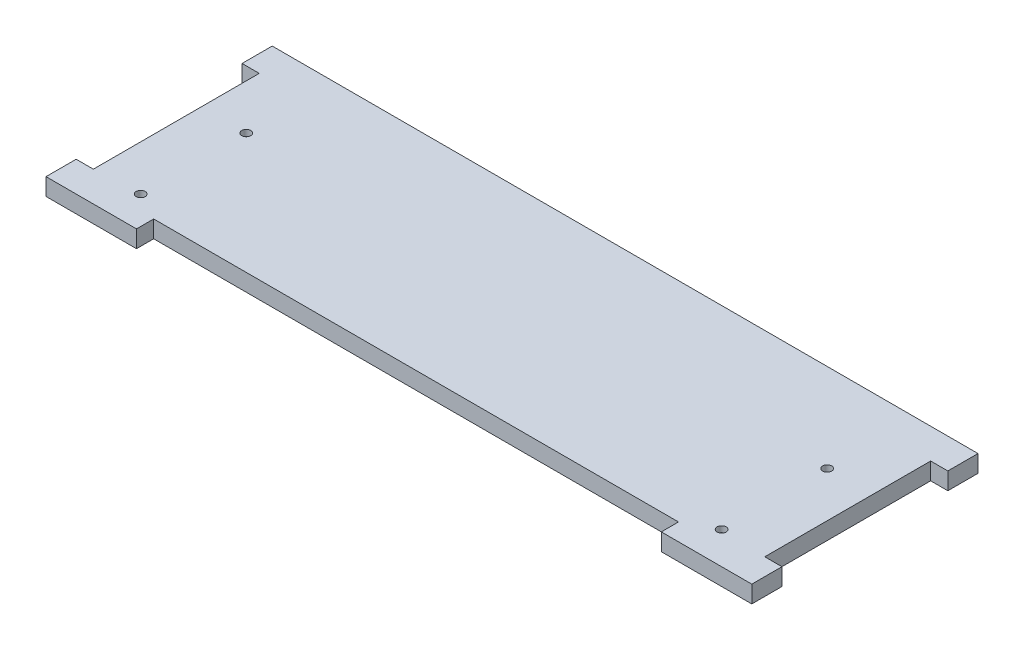
ISO-10303-21;
HEADER;
FILE_DESCRIPTION(('STEP AP214'),'2;1');
FILE_NAME('part.step','',(''),(''),'','','');
FILE_SCHEMA(('AUTOMOTIVE_DESIGN { 1 0 10303 214 1 1 1 1 }'));
ENDSEC;
DATA;
#1=APPLICATION_CONTEXT('core data for automotive mechanical design processes');
#2=APPLICATION_PROTOCOL_DEFINITION('international standard','automotive_design',2000,#1);
#3=PRODUCT_CONTEXT('',#1,'mechanical');
#4=PRODUCT('Part','Part','',(#3));
#5=PRODUCT_RELATED_PRODUCT_CATEGORY('part','',(#4));
#6=PRODUCT_DEFINITION_FORMATION('','',#4);
#7=PRODUCT_DEFINITION_CONTEXT('part definition',#1,'design');
#8=PRODUCT_DEFINITION('design','',#6,#7);
#9=PRODUCT_DEFINITION_SHAPE('','',#8);
#10=(LENGTH_UNIT() NAMED_UNIT(*) SI_UNIT(.MILLI.,.METRE.));
#11=(NAMED_UNIT(*) PLANE_ANGLE_UNIT() SI_UNIT($,.RADIAN.));
#12=(NAMED_UNIT(*) SI_UNIT($,.STERADIAN.) SOLID_ANGLE_UNIT());
#13=UNCERTAINTY_MEASURE_WITH_UNIT(LENGTH_MEASURE(1.E-05),#10,'distance_accuracy_value','');
#14=(GEOMETRIC_REPRESENTATION_CONTEXT(3) GLOBAL_UNCERTAINTY_ASSIGNED_CONTEXT((#13)) GLOBAL_UNIT_ASSIGNED_CONTEXT((#10,
#11,#12)) REPRESENTATION_CONTEXT('',''));
#15=CARTESIAN_POINT('',(0.,0.,0.));
#16=DIRECTION('',(0.,0.,1.));
#17=DIRECTION('',(1.,0.,0.));
#18=AXIS2_PLACEMENT_3D('',#15,#16,#17);
#19=CARTESIAN_POINT('',(0.,5.7,0.));
#20=DIRECTION('',(0.,0.,-1.));
#21=DIRECTION('',(-1.,0.,0.));
#22=AXIS2_PLACEMENT_3D('',#19,#20,#21);
#23=PLANE('',#22);
#24=DIRECTION('',(1.,0.,0.));
#25=VECTOR('',#24,1.);
#26=CARTESIAN_POINT('',(0.,0.,0.));
#27=LINE('',#26,#25);
#28=CARTESIAN_POINT('',(0.,0.,0.));
#29=VERTEX_POINT('',#28);
#30=CARTESIAN_POINT('',(30.,0.,0.));
#31=VERTEX_POINT('',#30);
#32=EDGE_CURVE('E162',#29,#31,#27,.T.);
#33=ORIENTED_EDGE('',*,*,#32,.T.);
#34=DIRECTION('',(0.,1.,0.));
#35=VECTOR('',#34,1.);
#36=CARTESIAN_POINT('',(30.,0.,0.));
#37=LINE('',#36,#35);
#38=CARTESIAN_POINT('',(30.,5.7,0.));
#39=VERTEX_POINT('',#38);
#40=EDGE_CURVE('E146',#31,#39,#37,.T.);
#41=ORIENTED_EDGE('',*,*,#40,.T.);
#42=DIRECTION('',(1.,0.,0.));
#43=VECTOR('',#42,1.);
#44=CARTESIAN_POINT('',(0.,5.7,0.));
#45=LINE('',#44,#43);
#46=CARTESIAN_POINT('',(0.,5.7,0.));
#47=VERTEX_POINT('',#46);
#48=EDGE_CURVE('E257',#47,#39,#45,.T.);
#49=ORIENTED_EDGE('',*,*,#48,.F.);
#50=DIRECTION('',(0.,-1.,0.));
#51=VECTOR('',#50,1.);
#52=CARTESIAN_POINT('',(0.,5.7,0.));
#53=LINE('',#52,#51);
#54=EDGE_CURVE('E11',#47,#29,#53,.T.);
#55=ORIENTED_EDGE('',*,*,#54,.T.);
#56=EDGE_LOOP('',(#33,#41,#49,#55));
#57=FACE_BOUND('',#56,.T.);
#58=ADVANCED_FACE('F33',(#57),#23,.F.);
#59=CARTESIAN_POINT('',(234.,5.7,0.));
#60=DIRECTION('',(-1.,0.,0.));
#61=DIRECTION('',(0.,0.,1.));
#62=AXIS2_PLACEMENT_3D('',#59,#60,#61);
#63=PLANE('',#62);
#64=DIRECTION('',(0.,0.,-1.));
#65=VECTOR('',#64,1.);
#66=CARTESIAN_POINT('',(234.,0.,0.));
#67=LINE('',#66,#65);
#68=CARTESIAN_POINT('',(234.,0.,0.));
#69=VERTEX_POINT('',#68);
#70=CARTESIAN_POINT('',(234.,0.,-10.));
#71=VERTEX_POINT('',#70);
#72=EDGE_CURVE('E171',#69,#71,#67,.T.);
#73=ORIENTED_EDGE('',*,*,#72,.T.);
#74=DIRECTION('',(0.,1.,0.));
#75=VECTOR('',#74,1.);
#76=CARTESIAN_POINT('',(234.,0.,-10.));
#77=LINE('',#76,#75);
#78=CARTESIAN_POINT('',(234.,5.7,-10.));
#79=VERTEX_POINT('',#78);
#80=EDGE_CURVE('E221',#71,#79,#77,.T.);
#81=ORIENTED_EDGE('',*,*,#80,.T.);
#82=DIRECTION('',(0.,0.,-1.));
#83=VECTOR('',#82,1.);
#84=CARTESIAN_POINT('',(234.,5.7,0.));
#85=LINE('',#84,#83);
#86=CARTESIAN_POINT('',(234.,5.7,0.));
#87=VERTEX_POINT('',#86);
#88=EDGE_CURVE('E195',#87,#79,#85,.T.);
#89=ORIENTED_EDGE('',*,*,#88,.F.);
#90=DIRECTION('',(0.,-1.,0.));
#91=VECTOR('',#90,1.);
#92=CARTESIAN_POINT('',(234.,5.7,0.));
#93=LINE('',#92,#91);
#94=EDGE_CURVE('E41',#87,#69,#93,.T.);
#95=ORIENTED_EDGE('',*,*,#94,.T.);
#96=EDGE_LOOP('',(#73,#81,#89,#95));
#97=FACE_BOUND('',#96,.T.);
#98=ADVANCED_FACE('F192',(#97),#63,.F.);
#99=CARTESIAN_POINT('',(0.,5.7,0.));
#100=DIRECTION('',(1.,0.,0.));
#101=DIRECTION('',(0.,0.,-1.));
#102=AXIS2_PLACEMENT_3D('',#99,#100,#101);
#103=PLANE('',#102);
#104=DIRECTION('',(0.,0.,1.));
#105=VECTOR('',#104,1.);
#106=CARTESIAN_POINT('',(0.,0.,0.));
#107=LINE('',#106,#105);
#108=CARTESIAN_POINT('',(0.,0.,-75.));
#109=VERTEX_POINT('',#108);
#110=CARTESIAN_POINT('',(0.,0.,-65.));
#111=VERTEX_POINT('',#110);
#112=EDGE_CURVE('E173',#109,#111,#107,.T.);
#113=ORIENTED_EDGE('',*,*,#112,.T.);
#114=DIRECTION('',(0.,1.,0.));
#115=VECTOR('',#114,1.);
#116=CARTESIAN_POINT('',(0.,0.,-65.));
#117=LINE('',#116,#115);
#118=CARTESIAN_POINT('',(0.,5.7,-65.));
#119=VERTEX_POINT('',#118);
#120=EDGE_CURVE('E244',#111,#119,#117,.T.);
#121=ORIENTED_EDGE('',*,*,#120,.T.);
#122=DIRECTION('',(0.,0.,1.));
#123=VECTOR('',#122,1.);
#124=CARTESIAN_POINT('',(0.,5.7,0.));
#125=LINE('',#124,#123);
#126=CARTESIAN_POINT('',(0.,5.7,-75.));
#127=VERTEX_POINT('',#126);
#128=EDGE_CURVE('E253',#127,#119,#125,.T.);
#129=ORIENTED_EDGE('',*,*,#128,.F.);
#130=DIRECTION('',(0.,-1.,0.));
#131=VECTOR('',#130,1.);
#132=CARTESIAN_POINT('',(0.,5.7,-75.));
#133=LINE('',#132,#131);
#134=EDGE_CURVE('E181',#127,#109,#133,.T.);
#135=ORIENTED_EDGE('',*,*,#134,.T.);
#136=EDGE_LOOP('',(#113,#121,#129,#135));
#137=FACE_BOUND('',#136,.T.);
#138=ADVANCED_FACE('F275',(#137),#103,.F.);
#139=CARTESIAN_POINT('',(0.,5.7,-10.));
#140=VERTEX_POINT('',#139);
#141=EDGE_CURVE('E180',#140,#47,#125,.T.);
#142=ORIENTED_EDGE('',*,*,#141,.F.);
#143=DIRECTION('',(0.,1.,0.));
#144=VECTOR('',#143,1.);
#145=CARTESIAN_POINT('',(0.,0.,-10.));
#146=LINE('',#145,#144);
#147=CARTESIAN_POINT('',(0.,0.,-10.));
#148=VERTEX_POINT('',#147);
#149=EDGE_CURVE('E237',#148,#140,#146,.T.);
#150=ORIENTED_EDGE('',*,*,#149,.F.);
#151=EDGE_CURVE('E247',#148,#29,#107,.T.);
#152=ORIENTED_EDGE('',*,*,#151,.T.);
#153=ORIENTED_EDGE('',*,*,#54,.F.);
#154=EDGE_LOOP('',(#142,#150,#152,#153));
#155=FACE_BOUND('',#154,.T.);
#156=ADVANCED_FACE('F35',(#155),#103,.F.);
#157=CARTESIAN_POINT('',(204.,5.7,0.));
#158=VERTEX_POINT('',#157);
#159=EDGE_CURVE('E256',#158,#87,#45,.T.);
#160=ORIENTED_EDGE('',*,*,#159,.F.);
#161=DIRECTION('',(0.,1.,0.));
#162=VECTOR('',#161,1.);
#163=CARTESIAN_POINT('',(204.,0.,0.));
#164=LINE('',#163,#162);
#165=CARTESIAN_POINT('',(204.,0.,0.));
#166=VERTEX_POINT('',#165);
#167=EDGE_CURVE('E156',#166,#158,#164,.T.);
#168=ORIENTED_EDGE('',*,*,#167,.F.);
#169=EDGE_CURVE('E169',#166,#69,#27,.T.);
#170=ORIENTED_EDGE('',*,*,#169,.T.);
#171=ORIENTED_EDGE('',*,*,#94,.F.);
#172=EDGE_LOOP('',(#160,#168,#170,#171));
#173=FACE_BOUND('',#172,.T.);
#174=ADVANCED_FACE('F290',(#173),#23,.F.);
#175=CARTESIAN_POINT('',(234.,5.7,-65.));
#176=VERTEX_POINT('',#175);
#177=CARTESIAN_POINT('',(234.,5.7,-75.));
#178=VERTEX_POINT('',#177);
#179=EDGE_CURVE('E259',#176,#178,#85,.T.);
#180=ORIENTED_EDGE('',*,*,#179,.F.);
#181=DIRECTION('',(0.,1.,0.));
#182=VECTOR('',#181,1.);
#183=CARTESIAN_POINT('',(234.,0.,-65.));
#184=LINE('',#183,#182);
#185=CARTESIAN_POINT('',(234.,0.,-65.));
#186=VERTEX_POINT('',#185);
#187=EDGE_CURVE('E204',#186,#176,#184,.T.);
#188=ORIENTED_EDGE('',*,*,#187,.F.);
#189=CARTESIAN_POINT('',(234.,0.,-75.));
#190=VERTEX_POINT('',#189);
#191=EDGE_CURVE('E168',#186,#190,#67,.T.);
#192=ORIENTED_EDGE('',*,*,#191,.T.);
#193=DIRECTION('',(0.,-1.,0.));
#194=VECTOR('',#193,1.);
#195=CARTESIAN_POINT('',(234.,5.7,-75.));
#196=LINE('',#195,#194);
#197=EDGE_CURVE('E184',#178,#190,#196,.T.);
#198=ORIENTED_EDGE('',*,*,#197,.F.);
#199=EDGE_LOOP('',(#180,#188,#192,#198));
#200=FACE_BOUND('',#199,.T.);
#201=ADVANCED_FACE('F296',(#200),#63,.F.);
#202=CARTESIAN_POINT('',(0.,5.7,-75.));
#203=DIRECTION('',(0.,0.,1.));
#204=DIRECTION('',(1.,0.,0.));
#205=AXIS2_PLACEMENT_3D('',#202,#203,#204);
#206=PLANE('',#205);
#207=DIRECTION('',(-1.,0.,0.));
#208=VECTOR('',#207,1.);
#209=CARTESIAN_POINT('',(0.,0.,-75.));
#210=LINE('',#209,#208);
#211=EDGE_CURVE('E178',#190,#109,#210,.T.);
#212=ORIENTED_EDGE('',*,*,#211,.T.);
#213=ORIENTED_EDGE('',*,*,#134,.F.);
#214=DIRECTION('',(-1.,0.,0.));
#215=VECTOR('',#214,1.);
#216=CARTESIAN_POINT('',(0.,5.7,-75.));
#217=LINE('',#216,#215);
#218=EDGE_CURVE('E185',#178,#127,#217,.T.);
#219=ORIENTED_EDGE('',*,*,#218,.F.);
#220=ORIENTED_EDGE('',*,*,#197,.T.);
#221=EDGE_LOOP('',(#212,#213,#219,#220));
#222=FACE_BOUND('',#221,.T.);
#223=ADVANCED_FACE('F270',(#222),#206,.F.);
#224=CARTESIAN_POINT('',(0.,5.7,0.));
#225=DIRECTION('',(0.,-1.,0.));
#226=DIRECTION('',(0.,0.,-1.));
#227=AXIS2_PLACEMENT_3D('',#224,#225,#226);
#228=PLANE('',#227);
#229=CARTESIAN_POINT('',(213.3,5.7,-10.7));
#230=DIRECTION('',(0.,1.,0.));
#231=DIRECTION('',(0.,0.,1.));
#232=AXIS2_PLACEMENT_3D('',#229,#230,#231);
#233=CIRCLE('',#232,1.5);
#234=CARTESIAN_POINT('',(213.3,5.7,-9.20000000000004));
#235=VERTEX_POINT('',#234);
#236=EDGE_CURVE('E374',#235,#235,#233,.T.);
#237=ORIENTED_EDGE('',*,*,#236,.F.);
#238=EDGE_LOOP('',(#237));
#239=FACE_BOUND('',#238,.T.);
#240=CARTESIAN_POINT('',(20.7,5.7,-10.6999999999999));
#241=DIRECTION('',(0.,1.,0.));
#242=DIRECTION('',(0.,0.,1.));
#243=AXIS2_PLACEMENT_3D('',#240,#241,#242);
#244=CIRCLE('',#243,1.5);
#245=CARTESIAN_POINT('',(20.7,5.7,-9.19999999999994));
#246=VERTEX_POINT('',#245);
#247=EDGE_CURVE('E385',#246,#246,#244,.T.);
#248=ORIENTED_EDGE('',*,*,#247,.F.);
#249=EDGE_LOOP('',(#248));
#250=FACE_BOUND('',#249,.T.);
#251=CARTESIAN_POINT('',(20.7,5.7,-45.6999999999999));
#252=DIRECTION('',(0.,1.,0.));
#253=DIRECTION('',(0.,0.,1.));
#254=AXIS2_PLACEMENT_3D('',#251,#252,#253);
#255=CIRCLE('',#254,1.5);
#256=CARTESIAN_POINT('',(20.7,5.7,-44.1999999999999));
#257=VERTEX_POINT('',#256);
#258=EDGE_CURVE('E391',#257,#257,#255,.T.);
#259=ORIENTED_EDGE('',*,*,#258,.F.);
#260=EDGE_LOOP('',(#259));
#261=FACE_BOUND('',#260,.T.);
#262=CARTESIAN_POINT('',(213.3,5.7,-45.7));
#263=DIRECTION('',(0.,1.,0.));
#264=DIRECTION('',(0.,0.,1.));
#265=AXIS2_PLACEMENT_3D('',#262,#263,#264);
#266=CIRCLE('',#265,1.5);
#267=CARTESIAN_POINT('',(213.3,5.7,-44.2));
#268=VERTEX_POINT('',#267);
#269=EDGE_CURVE('E373',#268,#268,#266,.T.);
#270=ORIENTED_EDGE('',*,*,#269,.F.);
#271=EDGE_LOOP('',(#270));
#272=FACE_BOUND('',#271,.T.);
#273=ORIENTED_EDGE('',*,*,#48,.T.);
#274=DIRECTION('',(0.,0.,1.));
#275=VECTOR('',#274,1.);
#276=CARTESIAN_POINT('',(30.,5.7,0.));
#277=LINE('',#276,#275);
#278=CARTESIAN_POINT('',(30.,5.7,-5.7));
#279=VERTEX_POINT('',#278);
#280=EDGE_CURVE('E151',#279,#39,#277,.T.);
#281=ORIENTED_EDGE('',*,*,#280,.F.);
#282=DIRECTION('',(-1.,0.,0.));
#283=VECTOR('',#282,1.);
#284=CARTESIAN_POINT('',(30.,5.7,-5.7));
#285=LINE('',#284,#283);
#286=CARTESIAN_POINT('',(204.,5.7,-5.7));
#287=VERTEX_POINT('',#286);
#288=EDGE_CURVE('E165',#287,#279,#285,.T.);
#289=ORIENTED_EDGE('',*,*,#288,.F.);
#290=DIRECTION('',(0.,0.,-1.));
#291=VECTOR('',#290,1.);
#292=CARTESIAN_POINT('',(204.,5.7,0.));
#293=LINE('',#292,#291);
#294=EDGE_CURVE('E399',#158,#287,#293,.T.);
#295=ORIENTED_EDGE('',*,*,#294,.F.);
#296=ORIENTED_EDGE('',*,*,#159,.T.);
#297=ORIENTED_EDGE('',*,*,#88,.T.);
#298=DIRECTION('',(1.,0.,0.));
#299=VECTOR('',#298,1.);
#300=CARTESIAN_POINT('',(234.,5.7,-10.));
#301=LINE('',#300,#299);
#302=CARTESIAN_POINT('',(228.3,5.7,-9.99999999999999));
#303=VERTEX_POINT('',#302);
#304=EDGE_CURVE('E219',#303,#79,#301,.T.);
#305=ORIENTED_EDGE('',*,*,#304,.F.);
#306=DIRECTION('',(0.,0.,1.));
#307=VECTOR('',#306,1.);
#308=CARTESIAN_POINT('',(228.3,5.7,-65.));
#309=LINE('',#308,#307);
#310=CARTESIAN_POINT('',(228.3,5.7,-65.));
#311=VERTEX_POINT('',#310);
#312=EDGE_CURVE('E215',#311,#303,#309,.T.);
#313=ORIENTED_EDGE('',*,*,#312,.F.);
#314=DIRECTION('',(-1.,0.,0.));
#315=VECTOR('',#314,1.);
#316=CARTESIAN_POINT('',(234.,5.7,-65.));
#317=LINE('',#316,#315);
#318=EDGE_CURVE('E212',#176,#311,#317,.T.);
#319=ORIENTED_EDGE('',*,*,#318,.F.);
#320=ORIENTED_EDGE('',*,*,#179,.T.);
#321=ORIENTED_EDGE('',*,*,#218,.T.);
#322=ORIENTED_EDGE('',*,*,#128,.T.);
#323=DIRECTION('',(-1.,0.,0.));
#324=VECTOR('',#323,1.);
#325=CARTESIAN_POINT('',(0.,5.7,-65.));
#326=LINE('',#325,#324);
#327=CARTESIAN_POINT('',(5.7,5.7,-65.));
#328=VERTEX_POINT('',#327);
#329=EDGE_CURVE('E231',#328,#119,#326,.T.);
#330=ORIENTED_EDGE('',*,*,#329,.F.);
#331=DIRECTION('',(0.,0.,-1.));
#332=VECTOR('',#331,1.);
#333=CARTESIAN_POINT('',(5.7,5.7,-65.));
#334=LINE('',#333,#332);
#335=CARTESIAN_POINT('',(5.70000000000001,5.7,-10.));
#336=VERTEX_POINT('',#335);
#337=EDGE_CURVE('E240',#336,#328,#334,.T.);
#338=ORIENTED_EDGE('',*,*,#337,.F.);
#339=DIRECTION('',(1.,0.,0.));
#340=VECTOR('',#339,1.);
#341=CARTESIAN_POINT('',(0.,5.7,-10.));
#342=LINE('',#341,#340);
#343=EDGE_CURVE('E223',#140,#336,#342,.T.);
#344=ORIENTED_EDGE('',*,*,#343,.F.);
#345=ORIENTED_EDGE('',*,*,#141,.T.);
#346=EDGE_LOOP('',(#273,#281,#289,#295,#296,#297,#305,#313,#319,#320,#321,#322,#330,#338,#344,#345));
#347=FACE_BOUND('',#346,.T.);
#348=ADVANCED_FACE('F263',(#239,#250,#261,#272,#347),#228,.F.);
#349=CARTESIAN_POINT('',(0.,0.,0.));
#350=DIRECTION('',(0.,-1.,0.));
#351=DIRECTION('',(0.,0.,-1.));
#352=AXIS2_PLACEMENT_3D('',#349,#350,#351);
#353=PLANE('',#352);
#354=DIRECTION('',(0.,0.,1.));
#355=VECTOR('',#354,1.);
#356=CARTESIAN_POINT('',(30.,0.,0.));
#357=LINE('',#356,#355);
#358=CARTESIAN_POINT('',(30.,0.,-5.7));
#359=VERTEX_POINT('',#358);
#360=EDGE_CURVE('E149',#359,#31,#357,.T.);
#361=ORIENTED_EDGE('',*,*,#360,.T.);
#362=ORIENTED_EDGE('',*,*,#32,.F.);
#363=ORIENTED_EDGE('',*,*,#151,.F.);
#364=DIRECTION('',(1.,0.,0.));
#365=VECTOR('',#364,1.);
#366=CARTESIAN_POINT('',(0.,0.,-10.));
#367=LINE('',#366,#365);
#368=CARTESIAN_POINT('',(5.70000000000001,0.,-10.));
#369=VERTEX_POINT('',#368);
#370=EDGE_CURVE('E227',#148,#369,#367,.T.);
#371=ORIENTED_EDGE('',*,*,#370,.T.);
#372=DIRECTION('',(0.,0.,-1.));
#373=VECTOR('',#372,1.);
#374=CARTESIAN_POINT('',(5.7,0.,-65.));
#375=LINE('',#374,#373);
#376=CARTESIAN_POINT('',(5.7,0.,-65.));
#377=VERTEX_POINT('',#376);
#378=EDGE_CURVE('E230',#369,#377,#375,.T.);
#379=ORIENTED_EDGE('',*,*,#378,.T.);
#380=DIRECTION('',(-1.,0.,0.));
#381=VECTOR('',#380,1.);
#382=CARTESIAN_POINT('',(0.,0.,-65.));
#383=LINE('',#382,#381);
#384=EDGE_CURVE('E234',#377,#111,#383,.T.);
#385=ORIENTED_EDGE('',*,*,#384,.T.);
#386=ORIENTED_EDGE('',*,*,#112,.F.);
#387=ORIENTED_EDGE('',*,*,#211,.F.);
#388=ORIENTED_EDGE('',*,*,#191,.F.);
#389=DIRECTION('',(-1.,0.,0.));
#390=VECTOR('',#389,1.);
#391=CARTESIAN_POINT('',(234.,0.,-65.));
#392=LINE('',#391,#390);
#393=CARTESIAN_POINT('',(228.3,0.,-65.));
#394=VERTEX_POINT('',#393);
#395=EDGE_CURVE('E208',#186,#394,#392,.T.);
#396=ORIENTED_EDGE('',*,*,#395,.T.);
#397=DIRECTION('',(0.,0.,1.));
#398=VECTOR('',#397,1.);
#399=CARTESIAN_POINT('',(228.3,0.,-65.));
#400=LINE('',#399,#398);
#401=CARTESIAN_POINT('',(228.3,0.,-9.99999999999999));
#402=VERTEX_POINT('',#401);
#403=EDGE_CURVE('E56',#394,#402,#400,.T.);
#404=ORIENTED_EDGE('',*,*,#403,.T.);
#405=DIRECTION('',(1.,0.,0.));
#406=VECTOR('',#405,1.);
#407=CARTESIAN_POINT('',(234.,0.,-10.));
#408=LINE('',#407,#406);
#409=EDGE_CURVE('E201',#402,#71,#408,.T.);
#410=ORIENTED_EDGE('',*,*,#409,.T.);
#411=ORIENTED_EDGE('',*,*,#72,.F.);
#412=ORIENTED_EDGE('',*,*,#169,.F.);
#413=DIRECTION('',(0.,0.,-1.));
#414=VECTOR('',#413,1.);
#415=CARTESIAN_POINT('',(204.,0.,0.));
#416=LINE('',#415,#414);
#417=CARTESIAN_POINT('',(204.,0.,-5.7));
#418=VERTEX_POINT('',#417);
#419=EDGE_CURVE('E164',#166,#418,#416,.T.);
#420=ORIENTED_EDGE('',*,*,#419,.T.);
#421=DIRECTION('',(-1.,0.,0.));
#422=VECTOR('',#421,1.);
#423=CARTESIAN_POINT('',(30.,0.,-5.7));
#424=LINE('',#423,#422);
#425=EDGE_CURVE('E48',#418,#359,#424,.T.);
#426=ORIENTED_EDGE('',*,*,#425,.T.);
#427=EDGE_LOOP('',(#361,#362,#363,#371,#379,#385,#386,#387,#388,#396,#404,#410,#411,#412,#420,#426));
#428=FACE_BOUND('',#427,.T.);
#429=ADVANCED_FACE('F160',(#428),#353,.T.);
#430=CARTESIAN_POINT('',(0.,0.,-65.));
#431=DIRECTION('',(0.,0.,-1.));
#432=DIRECTION('',(-1.,0.,0.));
#433=AXIS2_PLACEMENT_3D('',#430,#431,#432);
#434=PLANE('',#433);
#435=ORIENTED_EDGE('',*,*,#329,.T.);
#436=ORIENTED_EDGE('',*,*,#120,.F.);
#437=ORIENTED_EDGE('',*,*,#384,.F.);
#438=DIRECTION('',(0.,1.,0.));
#439=VECTOR('',#438,1.);
#440=CARTESIAN_POINT('',(5.7,0.,-65.));
#441=LINE('',#440,#439);
#442=EDGE_CURVE('E248',#377,#328,#441,.T.);
#443=ORIENTED_EDGE('',*,*,#442,.T.);
#444=EDGE_LOOP('',(#435,#436,#437,#443));
#445=FACE_BOUND('',#444,.T.);
#446=ADVANCED_FACE('F278',(#445),#434,.F.);
#447=CARTESIAN_POINT('',(5.7,0.,-65.));
#448=DIRECTION('',(1.,0.,0.));
#449=DIRECTION('',(0.,0.,-1.));
#450=AXIS2_PLACEMENT_3D('',#447,#448,#449);
#451=PLANE('',#450);
#452=ORIENTED_EDGE('',*,*,#337,.T.);
#453=ORIENTED_EDGE('',*,*,#442,.F.);
#454=ORIENTED_EDGE('',*,*,#378,.F.);
#455=DIRECTION('',(0.,1.,0.));
#456=VECTOR('',#455,1.);
#457=CARTESIAN_POINT('',(5.70000000000001,0.,-10.));
#458=LINE('',#457,#456);
#459=EDGE_CURVE('E250',#369,#336,#458,.T.);
#460=ORIENTED_EDGE('',*,*,#459,.T.);
#461=EDGE_LOOP('',(#452,#453,#454,#460));
#462=FACE_BOUND('',#461,.T.);
#463=ADVANCED_FACE('F281',(#462),#451,.F.);
#464=CARTESIAN_POINT('',(0.,0.,-10.));
#465=DIRECTION('',(0.,0.,1.));
#466=DIRECTION('',(1.,0.,0.));
#467=AXIS2_PLACEMENT_3D('',#464,#465,#466);
#468=PLANE('',#467);
#469=ORIENTED_EDGE('',*,*,#343,.T.);
#470=ORIENTED_EDGE('',*,*,#459,.F.);
#471=ORIENTED_EDGE('',*,*,#370,.F.);
#472=ORIENTED_EDGE('',*,*,#149,.T.);
#473=EDGE_LOOP('',(#469,#470,#471,#472));
#474=FACE_BOUND('',#473,.T.);
#475=ADVANCED_FACE('F283',(#474),#468,.F.);
#476=CARTESIAN_POINT('',(234.,0.,-10.));
#477=DIRECTION('',(0.,0.,1.));
#478=DIRECTION('',(1.,0.,0.));
#479=AXIS2_PLACEMENT_3D('',#476,#477,#478);
#480=PLANE('',#479);
#481=ORIENTED_EDGE('',*,*,#304,.T.);
#482=ORIENTED_EDGE('',*,*,#80,.F.);
#483=ORIENTED_EDGE('',*,*,#409,.F.);
#484=DIRECTION('',(0.,1.,0.));
#485=VECTOR('',#484,1.);
#486=CARTESIAN_POINT('',(228.3,0.,-9.99999999999999));
#487=LINE('',#486,#485);
#488=EDGE_CURVE('E224',#402,#303,#487,.T.);
#489=ORIENTED_EDGE('',*,*,#488,.T.);
#490=EDGE_LOOP('',(#481,#482,#483,#489));
#491=FACE_BOUND('',#490,.T.);
#492=ADVANCED_FACE('F314',(#491),#480,.F.);
#493=CARTESIAN_POINT('',(228.3,0.,-65.));
#494=DIRECTION('',(-1.,0.,0.));
#495=DIRECTION('',(0.,0.,1.));
#496=AXIS2_PLACEMENT_3D('',#493,#494,#495);
#497=PLANE('',#496);
#498=ORIENTED_EDGE('',*,*,#312,.T.);
#499=ORIENTED_EDGE('',*,*,#488,.F.);
#500=ORIENTED_EDGE('',*,*,#403,.F.);
#501=DIRECTION('',(0.,1.,0.));
#502=VECTOR('',#501,1.);
#503=CARTESIAN_POINT('',(228.3,0.,-65.));
#504=LINE('',#503,#502);
#505=EDGE_CURVE('E206',#394,#311,#504,.T.);
#506=ORIENTED_EDGE('',*,*,#505,.T.);
#507=EDGE_LOOP('',(#498,#499,#500,#506));
#508=FACE_BOUND('',#507,.T.);
#509=ADVANCED_FACE('F322',(#508),#497,.F.);
#510=CARTESIAN_POINT('',(234.,0.,-65.));
#511=DIRECTION('',(0.,0.,-1.));
#512=DIRECTION('',(-1.,0.,0.));
#513=AXIS2_PLACEMENT_3D('',#510,#511,#512);
#514=PLANE('',#513);
#515=ORIENTED_EDGE('',*,*,#318,.T.);
#516=ORIENTED_EDGE('',*,*,#505,.F.);
#517=ORIENTED_EDGE('',*,*,#395,.F.);
#518=ORIENTED_EDGE('',*,*,#187,.T.);
#519=EDGE_LOOP('',(#515,#516,#517,#518));
#520=FACE_BOUND('',#519,.T.);
#521=ADVANCED_FACE('F319',(#520),#514,.F.);
#522=CARTESIAN_POINT('',(30.,0.,0.));
#523=DIRECTION('',(-1.,0.,0.));
#524=DIRECTION('',(0.,0.,1.));
#525=AXIS2_PLACEMENT_3D('',#522,#523,#524);
#526=PLANE('',#525);
#527=ORIENTED_EDGE('',*,*,#280,.T.);
#528=ORIENTED_EDGE('',*,*,#40,.F.);
#529=ORIENTED_EDGE('',*,*,#360,.F.);
#530=DIRECTION('',(0.,1.,0.));
#531=VECTOR('',#530,1.);
#532=CARTESIAN_POINT('',(30.,0.,-5.7));
#533=LINE('',#532,#531);
#534=EDGE_CURVE('E216',#359,#279,#533,.T.);
#535=ORIENTED_EDGE('',*,*,#534,.T.);
#536=EDGE_LOOP('',(#527,#528,#529,#535));
#537=FACE_BOUND('',#536,.T.);
#538=ADVANCED_FACE('F148',(#537),#526,.F.);
#539=CARTESIAN_POINT('',(30.,0.,-5.7));
#540=DIRECTION('',(0.,0.,-1.));
#541=DIRECTION('',(-1.,0.,0.));
#542=AXIS2_PLACEMENT_3D('',#539,#540,#541);
#543=PLANE('',#542);
#544=ORIENTED_EDGE('',*,*,#288,.T.);
#545=ORIENTED_EDGE('',*,*,#534,.F.);
#546=ORIENTED_EDGE('',*,*,#425,.F.);
#547=DIRECTION('',(0.,1.,0.));
#548=VECTOR('',#547,1.);
#549=CARTESIAN_POINT('',(204.,0.,-5.7));
#550=LINE('',#549,#548);
#551=EDGE_CURVE('E405',#418,#287,#550,.T.);
#552=ORIENTED_EDGE('',*,*,#551,.T.);
#553=EDGE_LOOP('',(#544,#545,#546,#552));
#554=FACE_BOUND('',#553,.T.);
#555=ADVANCED_FACE('F330',(#554),#543,.F.);
#556=CARTESIAN_POINT('',(204.,0.,0.));
#557=DIRECTION('',(1.,0.,0.));
#558=DIRECTION('',(0.,0.,-1.));
#559=AXIS2_PLACEMENT_3D('',#556,#557,#558);
#560=PLANE('',#559);
#561=ORIENTED_EDGE('',*,*,#294,.T.);
#562=ORIENTED_EDGE('',*,*,#551,.F.);
#563=ORIENTED_EDGE('',*,*,#419,.F.);
#564=ORIENTED_EDGE('',*,*,#167,.T.);
#565=EDGE_LOOP('',(#561,#562,#563,#564));
#566=FACE_BOUND('',#565,.T.);
#567=ADVANCED_FACE('F331',(#566),#560,.F.);
#568=CARTESIAN_POINT('',(213.3,3.7,-45.7));
#569=DIRECTION('',(0.,1.,0.));
#570=DIRECTION('',(0.,0.,1.));
#571=AXIS2_PLACEMENT_3D('',#568,#569,#570);
#572=CYLINDRICAL_SURFACE('',#571,1.5);
#573=CARTESIAN_POINT('',(213.3,3.7,-45.7));
#574=DIRECTION('',(0.,1.,0.));
#575=DIRECTION('',(0.,0.,1.));
#576=AXIS2_PLACEMENT_3D('',#573,#574,#575);
#577=CIRCLE('',#576,1.5);
#578=CARTESIAN_POINT('',(213.3,3.7,-44.2));
#579=VERTEX_POINT('',#578);
#580=EDGE_CURVE('E377',#579,#579,#577,.T.);
#581=ORIENTED_EDGE('',*,*,#580,.F.);
#582=EDGE_LOOP('',(#581));
#583=FACE_BOUND('',#582,.T.);
#584=ORIENTED_EDGE('',*,*,#269,.T.);
#585=EDGE_LOOP('',(#584));
#586=FACE_BOUND('',#585,.T.);
#587=ADVANCED_FACE('F334',(#583,#586),#572,.F.);
#588=CARTESIAN_POINT('',(213.3,3.7,-45.7));
#589=DIRECTION('',(0.,1.,0.));
#590=DIRECTION('',(0.,0.,1.));
#591=AXIS2_PLACEMENT_3D('',#588,#589,#590);
#592=PLANE('',#591);
#593=ORIENTED_EDGE('',*,*,#580,.T.);
#594=EDGE_LOOP('',(#593));
#595=FACE_BOUND('',#594,.T.);
#596=ADVANCED_FACE('F340',(#595),#592,.T.);
#597=CARTESIAN_POINT('',(20.7,3.7,-45.6999999999999));
#598=DIRECTION('',(0.,1.,0.));
#599=DIRECTION('',(0.,0.,1.));
#600=AXIS2_PLACEMENT_3D('',#597,#598,#599);
#601=CYLINDRICAL_SURFACE('',#600,1.5);
#602=CARTESIAN_POINT('',(20.7,3.7,-45.6999999999999));
#603=DIRECTION('',(0.,1.,0.));
#604=DIRECTION('',(0.,0.,1.));
#605=AXIS2_PLACEMENT_3D('',#602,#603,#604);
#606=CIRCLE('',#605,1.5);
#607=CARTESIAN_POINT('',(20.7,3.7,-44.1999999999999));
#608=VERTEX_POINT('',#607);
#609=EDGE_CURVE('E388',#608,#608,#606,.T.);
#610=ORIENTED_EDGE('',*,*,#609,.F.);
#611=EDGE_LOOP('',(#610));
#612=FACE_BOUND('',#611,.T.);
#613=ORIENTED_EDGE('',*,*,#258,.T.);
#614=EDGE_LOOP('',(#613));
#615=FACE_BOUND('',#614,.T.);
#616=ADVANCED_FACE('F344',(#612,#615),#601,.F.);
#617=CARTESIAN_POINT('',(20.7,3.7,-45.6999999999999));
#618=DIRECTION('',(0.,1.,0.));
#619=DIRECTION('',(0.,0.,1.));
#620=AXIS2_PLACEMENT_3D('',#617,#618,#619);
#621=PLANE('',#620);
#622=ORIENTED_EDGE('',*,*,#609,.T.);
#623=EDGE_LOOP('',(#622));
#624=FACE_BOUND('',#623,.T.);
#625=ADVANCED_FACE('F348',(#624),#621,.T.);
#626=CARTESIAN_POINT('',(20.7,3.7,-10.6999999999999));
#627=DIRECTION('',(0.,1.,0.));
#628=DIRECTION('',(0.,0.,1.));
#629=AXIS2_PLACEMENT_3D('',#626,#627,#628);
#630=CYLINDRICAL_SURFACE('',#629,1.5);
#631=CARTESIAN_POINT('',(20.7,3.7,-10.6999999999999));
#632=DIRECTION('',(0.,1.,0.));
#633=DIRECTION('',(0.,0.,1.));
#634=AXIS2_PLACEMENT_3D('',#631,#632,#633);
#635=CIRCLE('',#634,1.5);
#636=CARTESIAN_POINT('',(20.7,3.7,-9.19999999999994));
#637=VERTEX_POINT('',#636);
#638=EDGE_CURVE('E380',#637,#637,#635,.T.);
#639=ORIENTED_EDGE('',*,*,#638,.F.);
#640=EDGE_LOOP('',(#639));
#641=FACE_BOUND('',#640,.T.);
#642=ORIENTED_EDGE('',*,*,#247,.T.);
#643=EDGE_LOOP('',(#642));
#644=FACE_BOUND('',#643,.T.);
#645=ADVANCED_FACE('F352',(#641,#644),#630,.F.);
#646=CARTESIAN_POINT('',(20.7,3.7,-10.6999999999999));
#647=DIRECTION('',(0.,1.,0.));
#648=DIRECTION('',(0.,0.,1.));
#649=AXIS2_PLACEMENT_3D('',#646,#647,#648);
#650=PLANE('',#649);
#651=ORIENTED_EDGE('',*,*,#638,.T.);
#652=EDGE_LOOP('',(#651));
#653=FACE_BOUND('',#652,.T.);
#654=ADVANCED_FACE('F356',(#653),#650,.T.);
#655=CARTESIAN_POINT('',(213.3,3.7,-10.7));
#656=DIRECTION('',(0.,1.,0.));
#657=DIRECTION('',(0.,0.,1.));
#658=AXIS2_PLACEMENT_3D('',#655,#656,#657);
#659=CYLINDRICAL_SURFACE('',#658,1.5);
#660=CARTESIAN_POINT('',(213.3,3.7,-10.7));
#661=DIRECTION('',(0.,1.,0.));
#662=DIRECTION('',(0.,0.,1.));
#663=AXIS2_PLACEMENT_3D('',#660,#661,#662);
#664=CIRCLE('',#663,1.5);
#665=CARTESIAN_POINT('',(213.3,3.7,-9.20000000000004));
#666=VERTEX_POINT('',#665);
#667=EDGE_CURVE('E372',#666,#666,#664,.T.);
#668=ORIENTED_EDGE('',*,*,#667,.F.);
#669=EDGE_LOOP('',(#668));
#670=FACE_BOUND('',#669,.T.);
#671=ORIENTED_EDGE('',*,*,#236,.T.);
#672=EDGE_LOOP('',(#671));
#673=FACE_BOUND('',#672,.T.);
#674=ADVANCED_FACE('F360',(#670,#673),#659,.F.);
#675=CARTESIAN_POINT('',(213.3,3.7,-10.7));
#676=DIRECTION('',(0.,1.,0.));
#677=DIRECTION('',(0.,0.,1.));
#678=AXIS2_PLACEMENT_3D('',#675,#676,#677);
#679=PLANE('',#678);
#680=ORIENTED_EDGE('',*,*,#667,.T.);
#681=EDGE_LOOP('',(#680));
#682=FACE_BOUND('',#681,.T.);
#683=ADVANCED_FACE('F364',(#682),#679,.T.);
#684=CLOSED_SHELL('',(#58,#98,#138,#156,#174,#201,#223,#348,#429,#446,#463,#475,#492,#509,#521,
#538,#555,#567,#587,#596,#616,#625,#645,#654,#674,#683));
#685=MANIFOLD_SOLID_BREP('B2',#684);
#686=ADVANCED_BREP_SHAPE_REPRESENTATION('',(#18,#685),#14);
#687=SHAPE_DEFINITION_REPRESENTATION(#9,#686);
ENDSEC;
END-ISO-10303-21;
